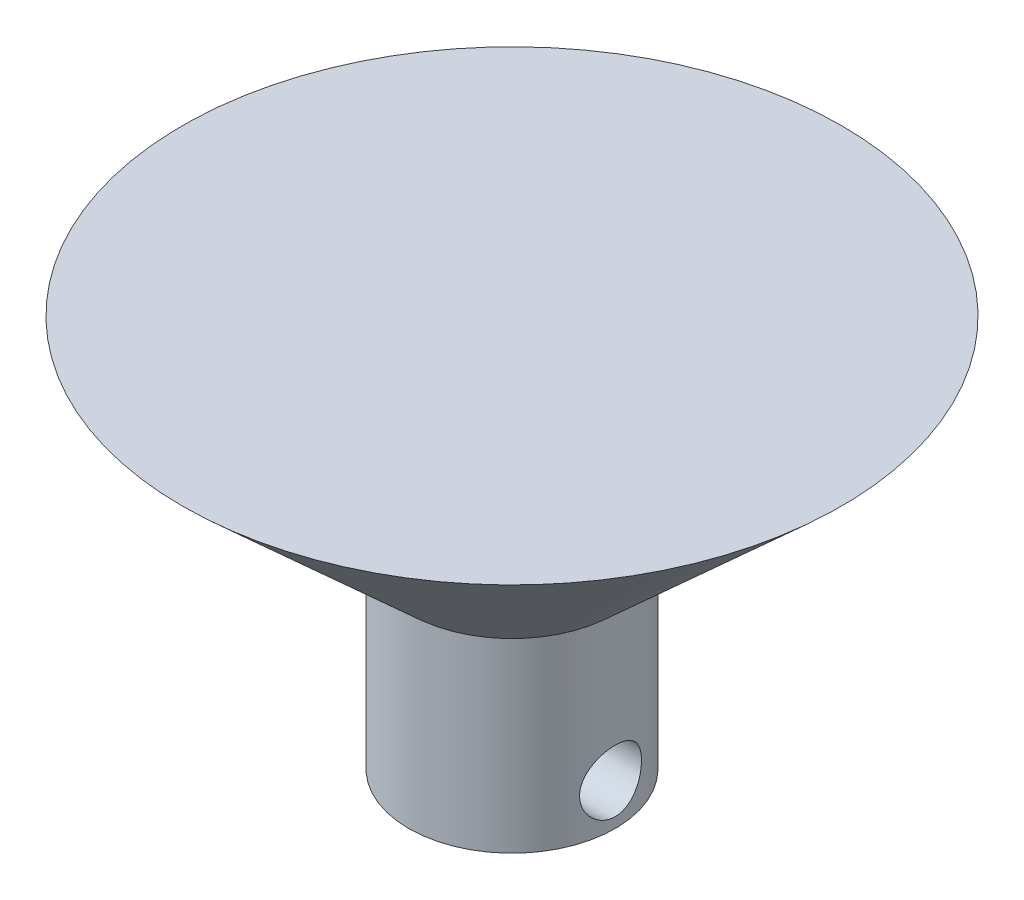
ISO-10303-21;
HEADER;
FILE_DESCRIPTION(('STEP AP214'),'2;1');
FILE_NAME('part.step','',(''),(''),'','','');
FILE_SCHEMA(('AUTOMOTIVE_DESIGN { 1 0 10303 214 1 1 1 1 }'));
ENDSEC;
DATA;
#1=APPLICATION_CONTEXT('core data for automotive mechanical design processes');
#2=APPLICATION_PROTOCOL_DEFINITION('international standard','automotive_design',2000,#1);
#3=PRODUCT_CONTEXT('',#1,'mechanical');
#4=PRODUCT('Part','Part','',(#3));
#5=PRODUCT_RELATED_PRODUCT_CATEGORY('part','',(#4));
#6=PRODUCT_DEFINITION_FORMATION('','',#4);
#7=PRODUCT_DEFINITION_CONTEXT('part definition',#1,'design');
#8=PRODUCT_DEFINITION('design','',#6,#7);
#9=PRODUCT_DEFINITION_SHAPE('','',#8);
#10=(LENGTH_UNIT() NAMED_UNIT(*) SI_UNIT(.MILLI.,.METRE.));
#11=(NAMED_UNIT(*) PLANE_ANGLE_UNIT() SI_UNIT($,.RADIAN.));
#12=(NAMED_UNIT(*) SI_UNIT($,.STERADIAN.) SOLID_ANGLE_UNIT());
#13=UNCERTAINTY_MEASURE_WITH_UNIT(LENGTH_MEASURE(1.E-05),#10,'distance_accuracy_value','');
#14=(GEOMETRIC_REPRESENTATION_CONTEXT(3) GLOBAL_UNCERTAINTY_ASSIGNED_CONTEXT((#13)) GLOBAL_UNIT_ASSIGNED_CONTEXT((#10,
#11,#12)) REPRESENTATION_CONTEXT('',''));
#15=CARTESIAN_POINT('',(0.,0.,0.));
#16=DIRECTION('',(0.,0.,1.));
#17=DIRECTION('',(1.,0.,0.));
#18=AXIS2_PLACEMENT_3D('',#15,#16,#17);
#19=CARTESIAN_POINT('',(0.,9.,0.));
#20=DIRECTION('',(0.,-1.,0.));
#21=DIRECTION('',(0.,0.,-1.));
#22=AXIS2_PLACEMENT_3D('',#19,#20,#21);
#23=CYLINDRICAL_SURFACE('',#22,5.);
#24=CARTESIAN_POINT('',(-5.,0.5,0.));
#25=CARTESIAN_POINT('',(-4.9999992925055,0.500000997484886,-0.0822886127533));
#26=CARTESIAN_POINT('',(-4.99794915693954,0.506793863623966,-0.164587318351529));
#27=CARTESIAN_POINT('',(-4.98997105593691,0.533721354222101,-0.326788125304881));
#28=CARTESIAN_POINT('',(-4.98404193389692,0.553859958023342,-0.40668950441142));
#29=CARTESIAN_POINT('',(-4.96895552501836,0.606746016910264,-0.561732707754527));
#30=CARTESIAN_POINT('',(-4.95980300250425,0.639474869618937,-0.636881364395373));
#31=CARTESIAN_POINT('',(-4.93922109237645,0.716536093055836,-0.780624181053131));
#32=CARTESIAN_POINT('',(-4.92779140192067,0.760870007395417,-0.84921746746967));
#33=CARTESIAN_POINT('',(-4.90350737192774,0.861224007472669,-0.979871797183745));
#34=CARTESIAN_POINT('',(-4.89062383657036,0.917516625885914,-1.04171807124434));
#35=CARTESIAN_POINT('',(-4.86505834210442,1.03960922991018,-1.15524920923324));
#36=CARTESIAN_POINT('',(-4.85237641724501,1.10541081212496,-1.20693236327441));
#37=CARTESIAN_POINT('',(-4.82834113993772,1.24647075303761,-1.29980037723708));
#38=CARTESIAN_POINT('',(-4.81702406663875,1.32190846099074,-1.34072309022213));
#39=CARTESIAN_POINT('',(-4.79743620394031,1.47898925423029,-1.4092139477476));
#40=CARTESIAN_POINT('',(-4.78916468313311,1.56063084392798,-1.43678529919973));
#41=CARTESIAN_POINT('',(-4.77690870838434,1.72539026613046,-1.47701633682652));
#42=CARTESIAN_POINT('',(-4.77281069324533,1.80840274386394,-1.49007196234677));
#43=CARTESIAN_POINT('',(-4.76902789749767,1.97553315621677,-1.50213730614672));
#44=CARTESIAN_POINT('',(-4.76934204760571,2.05965081805909,-1.50115042761078));
#45=CARTESIAN_POINT('',(-4.77424744067778,2.22338390860848,-1.48546977199812));
#46=CARTESIAN_POINT('',(-4.7786838859914,2.30305225036224,-1.47127205262685));
#47=CARTESIAN_POINT('',(-4.79108356228624,2.45881978627346,-1.43037420427056));
#48=CARTESIAN_POINT('',(-4.79904714132351,2.53491862737433,-1.40367284141641));
#49=CARTESIAN_POINT('',(-4.81772733074973,2.68260034966074,-1.33816026653682));
#50=CARTESIAN_POINT('',(-4.82848016115952,2.75410708395526,-1.29918816934642));
#51=CARTESIAN_POINT('',(-4.85150987000065,2.88973202201019,-1.21035222588683));
#52=CARTESIAN_POINT('',(-4.86378711746991,2.95384842941378,-1.16048574002588));
#53=CARTESIAN_POINT('',(-4.88911011297937,3.07568619076202,-1.04881290765546));
#54=CARTESIAN_POINT('',(-4.90216654310498,3.13302866402967,-0.986594907466972));
#55=CARTESIAN_POINT('',(-4.92712244063259,3.23655398406425,-0.853263259313967));
#56=CARTESIAN_POINT('',(-4.9390218351841,3.28273612841443,-0.782149051860888));
#57=CARTESIAN_POINT('',(-4.9604316006947,3.36285992246473,-0.632355038342803));
#58=CARTESIAN_POINT('',(-4.96992543668314,3.39671751624986,-0.55362774974795));
#59=CARTESIAN_POINT('',(-4.98533521832222,3.45059959009963,-0.39124541560352));
#60=CARTESIAN_POINT('',(-4.99125216186999,3.47062792853249,-0.307591751589582));
#61=CARTESIAN_POINT('',(-4.99868364643538,3.49565217789939,-0.140952242668332));
#62=CARTESIAN_POINT('',(-5.0003485041779,3.50116158580161,-0.0580500976011871));
#63=CARTESIAN_POINT('',(-4.9995292324176,3.49843084428792,0.107499605823383));
#64=CARTESIAN_POINT('',(-4.99704565677756,3.49019253034856,0.19014719669078));
#65=CARTESIAN_POINT('',(-4.98830696987163,3.4606153888885,0.350903605309697));
#66=CARTESIAN_POINT('',(-4.98213829799417,3.43957661241913,0.429072772614169));
#67=CARTESIAN_POINT('',(-4.96674347841533,3.3853567672218,0.580754638954522));
#68=CARTESIAN_POINT('',(-4.95751696321085,3.35217423896214,0.654266777025583));
#69=CARTESIAN_POINT('',(-4.93669654351325,3.27374683451887,0.796437189461052));
#70=CARTESIAN_POINT('',(-4.92505280829675,3.22824065905203,0.864943826199669));
#71=CARTESIAN_POINT('',(-4.90073468764318,3.12677524594719,0.993523307980147));
#72=CARTESIAN_POINT('',(-4.8880600443108,3.07081338811233,1.05359403235593));
#73=CARTESIAN_POINT('',(-4.86253171869138,2.94761269163066,1.16585744551027));
#74=CARTESIAN_POINT('',(-4.84968825033268,2.88003812422826,1.21768481231503));
#75=CARTESIAN_POINT('',(-4.82576515238464,2.73687206098647,1.30928995072154));
#76=CARTESIAN_POINT('',(-4.81468547654651,2.66128077544179,1.34906803829472));
#77=CARTESIAN_POINT('',(-4.79567189615055,2.50446750874531,1.41517347127168));
#78=CARTESIAN_POINT('',(-4.78772337843827,2.42327381346341,1.4415634693705));
#79=CARTESIAN_POINT('',(-4.77591594362794,2.25731203106852,1.48021730815114));
#80=CARTESIAN_POINT('',(-4.772055625083,2.17254517921233,1.49248598978779));
#81=CARTESIAN_POINT('',(-4.76899972496087,2.00563848162377,1.50221984485059));
#82=CARTESIAN_POINT('',(-4.76961647442754,1.92353634898242,1.5002805530849));
#83=CARTESIAN_POINT('',(-4.77499401288294,1.7608858966272,1.48307505444813));
#84=CARTESIAN_POINT('',(-4.77975463592551,1.68033751482365,1.46780938124716));
#85=CARTESIAN_POINT('',(-4.79275763670385,1.52405460085715,1.42476888804136));
#86=CARTESIAN_POINT('',(-4.80095604545965,1.44827271263831,1.39715175507068));
#87=CARTESIAN_POINT('',(-4.81990278909136,1.30235756118228,1.33031507121129));
#88=CARTESIAN_POINT('',(-4.83065161194312,1.23222538235924,1.29109329962876));
#89=CARTESIAN_POINT('',(-4.85397676425833,1.09683688347289,1.20048763805072));
#90=CARTESIAN_POINT('',(-4.86660540163798,1.03185123873959,1.14871276092994));
#91=CARTESIAN_POINT('',(-4.89201320450026,0.911297501692137,1.03517434629782));
#92=CARTESIAN_POINT('',(-4.90479240823905,0.855731860532243,0.973408217134502));
#93=CARTESIAN_POINT('',(-4.92950936570649,0.75397658770497,0.839465762183249));
#94=CARTESIAN_POINT('',(-4.94141159765674,0.708108553144511,0.767037885790608));
#95=CARTESIAN_POINT('',(-4.96260680455813,0.629264830095975,0.615141373983529));
#96=CARTESIAN_POINT('',(-4.97190099931067,0.596283111725492,0.535676052998955));
#97=CARTESIAN_POINT('',(-4.98602174969301,0.547104724347251,0.380757712655282));
#98=CARTESIAN_POINT('',(-4.99122027381068,0.529488327116752,0.305786961954234));
#99=CARTESIAN_POINT('',(-4.99820944494492,0.505936474758423,0.15388019523078));
#100=CARTESIAN_POINT('',(-5.0000006615474,0.499999067295181,0.0769445098581397));
#101=CARTESIAN_POINT('',(-5.,0.5,0.));
#102=B_SPLINE_CURVE_WITH_KNOTS('',3,(#24,#25,#26,#27,#28,#29,#30,#31,#32,#33,#34,#35,#36,#37,
#38,#39,#40,#41,#42,#43,#44,#45,#46,#47,#48,#49,#50,#51,#52,#53,#54,#55,#56,#57,#58,#59,#60,#61,
#62,#63,#64,#65,#66,#67,#68,#69,#70,#71,#72,#73,#74,#75,#76,#77,#78,#79,#80,#81,#82,#83,#84,#85,
#86,#87,#88,#89,#90,#91,#92,#93,#94,#95,#96,#97,#98,#99,#100,#101),.UNSPECIFIED.,.T.,.F.,(4,2,2,
2,2,2,2,2,2,2,2,2,2,2,2,2,2,2,2,2,2,2,2,2,2,2,2,2,2,2,2,2,2,2,2,2,2,2,4),(0.,0.246583203612611,
0.493239964846,0.739533676300874,0.985860164412702,1.23855602948191,1.49129437288633,
1.74971481004109,2.00807314543224,2.25919689356599,2.51025978319089,2.75226016697676,
2.99428443658001,3.23962426447119,3.48502360158555,3.74067104048166,3.99633456531071,
4.25371046881688,4.51101453528808,4.75908809438545,5.00712853550327,5.24956746682327,
5.49203554593728,5.74011305702908,5.98825282000191,6.24540400322818,6.5025484425268,
6.75847814951252,7.01432009460283,7.25950155466943,7.504673196616,7.74680040402721,
7.98897397553107,8.23996925679931,8.49102974897502,8.74942996156671,9.00770911595235,
9.23831691930459,9.46888616948874),.UNSPECIFIED.);
#103=CARTESIAN_POINT('',(-5.,0.5,0.));
#104=VERTEX_POINT('',#103);
#105=EDGE_CURVE('E11',#104,#104,#102,.T.);
#106=ORIENTED_EDGE('',*,*,#105,.T.);
#107=EDGE_LOOP('',(#106));
#108=FACE_BOUND('',#107,.T.);
#109=CARTESIAN_POINT('',(4.76969600708473,2.,-1.5));
#110=CARTESIAN_POINT('',(4.7696968572698,1.9178054520576,-1.49999897633764));
#111=CARTESIAN_POINT('',(4.77184390209069,1.83560077585598,-1.49322108167142));
#112=CARTESIAN_POINT('',(4.780165783029,1.67359475040806,-1.46635844446749));
#113=CARTESIAN_POINT('',(4.78634196493468,1.59379421349853,-1.44626925573578));
#114=CARTESIAN_POINT('',(4.80196102485632,1.43896527172827,-1.39352753269955));
#115=CARTESIAN_POINT('',(4.81139846703232,1.36392917036691,-1.36089589394243));
#116=CARTESIAN_POINT('',(4.83246932547567,1.2203780660047,-1.28406421917929));
#117=CARTESIAN_POINT('',(4.84410307041019,1.15186404131556,-1.23986245137053));
#118=CARTESIAN_POINT('',(4.86866862185765,1.02113360942262,-1.13964754141627));
#119=CARTESIAN_POINT('',(4.88162808311636,0.959154102053713,-1.08333207175807));
#120=CARTESIAN_POINT('',(4.90714861936757,0.845362048677491,-0.961136237579599));
#121=CARTESIAN_POINT('',(4.91970964297705,0.793550809550121,-0.895254645461111));
#122=CARTESIAN_POINT('',(4.94333214579389,0.700537300166693,-0.75411143779369));
#123=CARTESIAN_POINT('',(4.95435724342404,0.659576575557191,-0.678684021335815));
#124=CARTESIAN_POINT('',(4.97334435920684,0.591012740957243,-0.521624645369354));
#125=CARTESIAN_POINT('',(4.98130703789495,0.563406750142551,-0.439994028387912));
#126=CARTESIAN_POINT('',(4.99307646003589,0.523119998909491,-0.27532385263083));
#127=CARTESIAN_POINT('',(4.99699557369338,0.510034872347297,-0.192391398953801));
#128=CARTESIAN_POINT('',(5.00063201501348,0.497882675353559,-0.025421823749315));
#129=CARTESIAN_POINT('',(5.00035022521079,0.498812660598037,0.0586150620503682));
#130=CARTESIAN_POINT('',(4.99569603817659,0.514392868543023,0.22257115660016));
#131=CARTESIAN_POINT('',(4.9914542020526,0.528605193809869,0.302536267641341));
#132=CARTESIAN_POINT('',(4.97951522112593,0.56963133599429,0.458889213442527));
#133=CARTESIAN_POINT('',(4.97181785750586,0.596445950942671,0.535276821322846));
#134=CARTESIAN_POINT('',(4.95365220986963,0.662212023418558,0.683347326351281));
#135=CARTESIAN_POINT('',(4.94315269676706,0.701301202807267,0.754965064694478));
#136=CARTESIAN_POINT('',(4.92049640648069,0.790397852428228,0.890764673783156));
#137=CARTESIAN_POINT('',(4.90833923637778,0.840407912963484,0.954944774872131));
#138=CARTESIAN_POINT('',(4.88311550488165,0.952197750751597,1.0766604815298));
#139=CARTESIAN_POINT('',(4.87003195321461,1.01435691902974,1.13384458040111));
#140=CARTESIAN_POINT('',(4.84483979887497,1.14751001789005,1.23707651539824));
#141=CARTESIAN_POINT('',(4.8327312931702,1.21850482538923,1.28312324482853));
#142=CARTESIAN_POINT('',(4.81077903197678,1.36823946924899,1.3631399533545));
#143=CARTESIAN_POINT('',(4.80095810695957,1.44704704586292,1.39698989237679));
#144=CARTESIAN_POINT('',(4.78496392548436,1.60960720844554,1.45083362878413));
#145=CARTESIAN_POINT('',(4.7787894791583,1.69335817153456,1.4708319464056));
#146=CARTESIAN_POINT('',(4.77104849541241,1.86008236073928,1.49574770282165));
#147=CARTESIAN_POINT('',(4.7693187867044,1.94296822389398,1.50119946380212));
#148=CARTESIAN_POINT('',(4.77021192441924,2.10847290000987,1.49835947233062));
#149=CARTESIAN_POINT('',(4.77283416156589,2.19109174873085,1.4900696437133));
#150=CARTESIAN_POINT('',(4.78197558554912,2.35148837797087,1.4604576357419));
#151=CARTESIAN_POINT('',(4.78839176507489,2.42933616426352,1.4394796143128));
#152=CARTESIAN_POINT('',(4.80429141231227,2.58040169081492,1.3854857774794));
#153=CARTESIAN_POINT('',(4.81377535359073,2.65361871414057,1.3524681034276));
#154=CARTESIAN_POINT('',(4.83505835023047,2.79551746407213,1.274318711965));
#155=CARTESIAN_POINT('',(4.84691271069799,2.86402472098579,1.22888564172729));
#156=CARTESIAN_POINT('',(4.87148205646987,2.9926381061808,1.12755301600385));
#157=CARTESIAN_POINT('',(4.88419724730003,3.05274221761279,1.07165095534897));
#158=CARTESIAN_POINT('',(4.90963633548158,3.16518040581474,0.948455132493599));
#159=CARTESIAN_POINT('',(4.92234245063004,3.21713562898698,0.880811065857434));
#160=CARTESIAN_POINT('',(4.94584851748651,3.30896670102775,0.737461784590249));
#161=CARTESIAN_POINT('',(4.95664856384717,3.34884314978146,0.661756970543944));
#162=CARTESIAN_POINT('',(4.97505970474957,3.4150000305683,0.504935504705222));
#163=CARTESIAN_POINT('',(4.98269453424966,3.44138201615898,0.423864622037839));
#164=CARTESIAN_POINT('',(4.99401979596827,3.48006091889042,0.258169966504588));
#165=CARTESIAN_POINT('',(4.9977113567088,3.49236186594842,0.173547217354763));
#166=CARTESIAN_POINT('',(5.00066544081399,3.5022230440545,0.00665215388274265));
#167=CARTESIAN_POINT('',(5.00009305111322,3.50033269540783,-0.0755851790862068));
#168=CARTESIAN_POINT('',(4.99497264465037,3.48317836750088,-0.238519481164404));
#169=CARTESIAN_POINT('',(4.99042485330462,3.46791514651956,-0.319216537346529));
#170=CARTESIAN_POINT('',(4.97791168358327,3.42478833860038,-0.475935813041358));
#171=CARTESIAN_POINT('',(4.96998352900866,3.39706181935099,-0.551998927351392));
#172=CARTESIAN_POINT('',(4.9515294303945,3.32991808549281,-0.698433237752053));
#173=CARTESIAN_POINT('',(4.94100305949946,3.29049894971381,-0.76880349605058));
#174=CARTESIAN_POINT('',(4.91803965828228,3.19962654256996,-0.904301892420563));
#175=CARTESIAN_POINT('',(4.90555226923559,3.14782856999923,-0.969190250076767));
#176=CARTESIAN_POINT('',(4.88023537212334,3.0342896116672,-1.08953757134594));
#177=CARTESIAN_POINT('',(4.86740576641079,2.97254576210185,-1.14499380960194));
#178=CARTESIAN_POINT('',(4.84240680631319,2.83865922168949,-1.24656269394549));
#179=CARTESIAN_POINT('',(4.83026852693485,2.76626144660956,-1.29234759757956));
#180=CARTESIAN_POINT('',(4.80852547508793,2.61444482583898,-1.37104313528776));
#181=CARTESIAN_POINT('',(4.79891948596956,2.53502937639881,-1.40395995557289));
#182=CARTESIAN_POINT('',(4.78427816717594,2.38025956839373,-1.4530194253295));
#183=CARTESIAN_POINT('',(4.7788615484052,2.30539135306901,-1.47058859011232));
#184=CARTESIAN_POINT('',(4.77157042597167,2.15368477750423,-1.49407818835144));
#185=CARTESIAN_POINT('',(4.7696952122143,2.07684681535475,-1.50000095706095));
#186=CARTESIAN_POINT('',(4.76969600708473,2.,-1.5));
#187=B_SPLINE_CURVE_WITH_KNOTS('',3,(#109,#110,#111,#112,#113,#114,#115,#116,#117,#118,#119,
#120,#121,#122,#123,#124,#125,#126,#127,#128,#129,#130,#131,#132,#133,#134,#135,#136,#137,#138,
#139,#140,#141,#142,#143,#144,#145,#146,#147,#148,#149,#150,#151,#152,#153,#154,#155,#156,#157,
#158,#159,#160,#161,#162,#163,#164,#165,#166,#167,#168,#169,#170,#171,#172,#173,#174,#175,#176,
#177,#178,#179,#180,#181,#182,#183,#184,#185,#186),.UNSPECIFIED.,.T.,.F.,(4,2,2,2,2,2,2,2,2,2,2,
2,2,2,2,2,2,2,2,2,2,2,2,2,2,2,2,2,2,2,2,2,2,2,2,2,2,2,4),(0.,0.246300165915542,0.492682641689,
0.738656414466193,0.984667025370101,1.23773150007984,1.49082847871273,1.74915939273645,
2.00743455587877,2.25832140149558,2.5091555410144,2.7520012599088,2.99486235890376,
3.24055209335676,3.4863001659083,3.74152147023278,3.99676812491863,4.25446238246266,
4.51207250628411,4.76008080790309,5.00805439107388,5.24958594938817,5.49115481045787,
5.73920731809388,5.98731925928923,6.24479506100602,6.50225807324202,6.75775391814325,
7.01317662321682,7.2587630391122,7.50433553047755,7.74727096872219,7.99024634491378,
8.24099627054488,8.4918185262989,8.75011639669147,9.00828993963944,9.23861153857447,
9.4688869503356),.UNSPECIFIED.);
#188=CARTESIAN_POINT('',(4.76969600708473,2.,-1.5));
#189=VERTEX_POINT('',#188);
#190=EDGE_CURVE('E41',#189,#189,#187,.T.);
#191=ORIENTED_EDGE('',*,*,#190,.T.);
#192=EDGE_LOOP('',(#191));
#193=FACE_BOUND('',#192,.T.);
#194=CARTESIAN_POINT('',(0.,9.,0.));
#195=DIRECTION('',(0.,1.,0.));
#196=DIRECTION('',(0.,0.,1.));
#197=AXIS2_PLACEMENT_3D('',#194,#195,#196);
#198=CIRCLE('',#197,5.);
#199=CARTESIAN_POINT('',(0.,9.,5.));
#200=VERTEX_POINT('',#199);
#201=EDGE_CURVE('E46',#200,#200,#198,.T.);
#202=ORIENTED_EDGE('',*,*,#201,.F.);
#203=EDGE_LOOP('',(#202));
#204=FACE_BOUND('',#203,.T.);
#205=CARTESIAN_POINT('',(0.,0.,0.));
#206=DIRECTION('',(0.,1.,0.));
#207=DIRECTION('',(0.,0.,1.));
#208=AXIS2_PLACEMENT_3D('',#205,#206,#207);
#209=CIRCLE('',#208,5.);
#210=CARTESIAN_POINT('',(0.,0.,5.));
#211=VERTEX_POINT('',#210);
#212=EDGE_CURVE('E72',#211,#211,#209,.T.);
#213=ORIENTED_EDGE('',*,*,#212,.T.);
#214=EDGE_LOOP('',(#213));
#215=FACE_BOUND('',#214,.T.);
#216=ADVANCED_FACE('F33',(#108,#193,#204,#215),#23,.T.);
#217=CARTESIAN_POINT('',(0.,0.,0.));
#218=DIRECTION('',(0.,1.,0.));
#219=DIRECTION('',(0.,0.,1.));
#220=AXIS2_PLACEMENT_3D('',#217,#218,#219);
#221=PLANE('',#220);
#222=ORIENTED_EDGE('',*,*,#212,.F.);
#223=EDGE_LOOP('',(#222));
#224=FACE_BOUND('',#223,.T.);
#225=ADVANCED_FACE('F59',(#224),#221,.F.);
#226=CARTESIAN_POINT('',(-5.,2.,0.));
#227=DIRECTION('',(1.,0.,0.));
#228=DIRECTION('',(0.,0.,-1.));
#229=AXIS2_PLACEMENT_3D('',#226,#227,#228);
#230=CYLINDRICAL_SURFACE('',#229,1.5);
#231=ORIENTED_EDGE('',*,*,#190,.F.);
#232=EDGE_LOOP('',(#231));
#233=FACE_BOUND('',#232,.T.);
#234=ORIENTED_EDGE('',*,*,#105,.F.);
#235=EDGE_LOOP('',(#234));
#236=FACE_BOUND('',#235,.T.);
#237=ADVANCED_FACE('F54',(#233,#236),#230,.F.);
#238=CARTESIAN_POINT('',(0.,19.,0.));
#239=DIRECTION('',(0.,1.,0.));
#240=DIRECTION('',(0.,0.,1.));
#241=AXIS2_PLACEMENT_3D('',#238,#239,#240);
#242=PLANE('',#241);
#243=CARTESIAN_POINT('',(0.,19.,0.));
#244=DIRECTION('',(0.,1.,0.));
#245=DIRECTION('',(0.,0.,1.));
#246=AXIS2_PLACEMENT_3D('',#243,#244,#245);
#247=CIRCLE('',#246,15.958);
#248=CARTESIAN_POINT('',(0.,19.,15.958));
#249=VERTEX_POINT('',#248);
#250=EDGE_CURVE('E74',#249,#249,#247,.T.);
#251=ORIENTED_EDGE('',*,*,#250,.T.);
#252=EDGE_LOOP('',(#251));
#253=FACE_BOUND('',#252,.T.);
#254=ADVANCED_FACE('F58',(#253),#242,.T.);
#255=CARTESIAN_POINT('',(0.,9.,0.));
#256=DIRECTION('',(0.,1.,0.));
#257=DIRECTION('',(0.,0.,1.));
#258=AXIS2_PLACEMENT_3D('',#255,#256,#257);
#259=CONICAL_SURFACE('',#258,5.,0.831076835273768);
#260=CARTESIAN_POINT('',(0.,19.,15.958));
#261=CARTESIAN_POINT('',(0.,18.8958333333333,15.8438541666667));
#262=CARTESIAN_POINT('',(0.,18.7916666666667,15.7297083333333));
#263=CARTESIAN_POINT('',(0.,18.5833333333333,15.5014166666667));
#264=CARTESIAN_POINT('',(0.,18.4791666666667,15.3872708333333));
#265=CARTESIAN_POINT('',(0.,18.2708333333333,15.1589791666667));
#266=CARTESIAN_POINT('',(0.,18.1666666666667,15.0448333333333));
#267=CARTESIAN_POINT('',(0.,17.9583333333333,14.8165416666667));
#268=CARTESIAN_POINT('',(0.,17.8541666666667,14.7023958333333));
#269=CARTESIAN_POINT('',(0.,17.6458333333333,14.4741041666667));
#270=CARTESIAN_POINT('',(0.,17.5416666666667,14.3599583333333));
#271=CARTESIAN_POINT('',(0.,17.3333333333333,14.1316666666667));
#272=CARTESIAN_POINT('',(0.,17.2291666666667,14.0175208333333));
#273=CARTESIAN_POINT('',(0.,17.0208333333333,13.7892291666667));
#274=CARTESIAN_POINT('',(0.,16.9166666666667,13.6750833333333));
#275=CARTESIAN_POINT('',(0.,16.7083333333333,13.4467916666667));
#276=CARTESIAN_POINT('',(0.,16.6041666666667,13.3326458333333));
#277=CARTESIAN_POINT('',(0.,16.3958333333333,13.1043541666667));
#278=CARTESIAN_POINT('',(0.,16.2916666666667,12.9902083333333));
#279=CARTESIAN_POINT('',(0.,16.0833333333333,12.7619166666667));
#280=CARTESIAN_POINT('',(0.,15.9791666666667,12.6477708333333));
#281=CARTESIAN_POINT('',(0.,15.7708333333333,12.4194791666667));
#282=CARTESIAN_POINT('',(0.,15.6666666666667,12.3053333333333));
#283=CARTESIAN_POINT('',(0.,15.4583333333333,12.0770416666667));
#284=CARTESIAN_POINT('',(0.,15.3541666666667,11.9628958333333));
#285=CARTESIAN_POINT('',(0.,15.1458333333333,11.7346041666667));
#286=CARTESIAN_POINT('',(0.,15.0416666666667,11.6204583333333));
#287=CARTESIAN_POINT('',(0.,14.8333333333333,11.3921666666667));
#288=CARTESIAN_POINT('',(0.,14.7291666666667,11.2780208333333));
#289=CARTESIAN_POINT('',(0.,14.5208333333333,11.0497291666667));
#290=CARTESIAN_POINT('',(0.,14.4166666666667,10.9355833333333));
#291=CARTESIAN_POINT('',(0.,14.2083333333333,10.7072916666667));
#292=CARTESIAN_POINT('',(0.,14.1041666666667,10.5931458333333));
#293=CARTESIAN_POINT('',(0.,13.8958333333333,10.3648541666667));
#294=CARTESIAN_POINT('',(0.,13.7916666666667,10.2507083333333));
#295=CARTESIAN_POINT('',(0.,13.5833333333333,10.0224166666667));
#296=CARTESIAN_POINT('',(0.,13.4791666666667,9.90827083333333));
#297=CARTESIAN_POINT('',(0.,13.2708333333333,9.67997916666667));
#298=CARTESIAN_POINT('',(0.,13.1666666666667,9.56583333333333));
#299=CARTESIAN_POINT('',(0.,12.9583333333333,9.33754166666667));
#300=CARTESIAN_POINT('',(0.,12.8541666666667,9.22339583333333));
#301=CARTESIAN_POINT('',(0.,12.6458333333333,8.99510416666667));
#302=CARTESIAN_POINT('',(0.,12.5416666666667,8.88095833333333));
#303=CARTESIAN_POINT('',(0.,12.3333333333333,8.65266666666667));
#304=CARTESIAN_POINT('',(0.,12.2291666666667,8.53852083333333));
#305=CARTESIAN_POINT('',(0.,12.0208333333333,8.31022916666667));
#306=CARTESIAN_POINT('',(0.,11.9166666666667,8.19608333333333));
#307=CARTESIAN_POINT('',(0.,11.7083333333333,7.96779166666667));
#308=CARTESIAN_POINT('',(0.,11.6041666666667,7.85364583333333));
#309=CARTESIAN_POINT('',(0.,11.3958333333333,7.62535416666667));
#310=CARTESIAN_POINT('',(0.,11.2916666666667,7.51120833333333));
#311=CARTESIAN_POINT('',(0.,11.0833333333333,7.28291666666667));
#312=CARTESIAN_POINT('',(0.,10.9791666666667,7.16877083333333));
#313=CARTESIAN_POINT('',(0.,10.7708333333333,6.94047916666667));
#314=CARTESIAN_POINT('',(0.,10.6666666666667,6.82633333333333));
#315=CARTESIAN_POINT('',(0.,10.4583333333333,6.59804166666667));
#316=CARTESIAN_POINT('',(0.,10.3541666666667,6.48389583333333));
#317=CARTESIAN_POINT('',(0.,10.1458333333333,6.25560416666667));
#318=CARTESIAN_POINT('',(0.,10.0416666666667,6.14145833333333));
#319=CARTESIAN_POINT('',(0.,9.83333333333333,5.91316666666667));
#320=CARTESIAN_POINT('',(0.,9.72916666666667,5.79902083333333));
#321=CARTESIAN_POINT('',(0.,9.52083333333333,5.57072916666667));
#322=CARTESIAN_POINT('',(0.,9.41666666666667,5.45658333333333));
#323=CARTESIAN_POINT('',(0.,9.20833333333333,5.22829166666667));
#324=CARTESIAN_POINT('',(0.,9.10416666666667,5.11414583333333));
#325=CARTESIAN_POINT('',(0.,9.,5.));
#326=B_SPLINE_CURVE_WITH_KNOTS('',3,(#260,#261,#262,#263,#264,#265,#266,#267,#268,#269,#270,
#271,#272,#273,#274,#275,#276,#277,#278,#279,#280,#281,#282,#283,#284,#285,#286,#287,#288,#289,
#290,#291,#292,#293,#294,#295,#296,#297,#298,#299,#300,#301,#302,#303,#304,#305,#306,#307,#308,
#309,#310,#311,#312,#313,#314,#315,#316,#317,#318,#319,#320,#321,#322,#323,#324,#325),
.UNSPECIFIED.,.F.,.F.,(4,2,2,2,2,2,2,2,2,2,2,2,2,2,2,2,2,2,2,2,2,2,2,2,2,2,2,2,2,2,2,2,4),(0.,
0.46359431770272,0.92718863540544,1.39078295310816,1.85437727081088,2.3179715885136,
2.78156590621631,3.24516022391903,3.70875454162175,4.17234885932447,4.63594317702719,
5.09953749472991,5.56313181243263,6.02672613013535,6.49032044783807,6.95391476554079,
7.41750908324351,7.88110340094623,8.34469771864895,8.80829203635167,9.27188635405439,
9.73548067175711,10.1990749894598,10.6626693071625,11.1262636248653,11.589857942568,
12.0534522602707,12.5170465779734,12.9806408956761,13.4442352133789,13.9078295310816,
14.3714238487843,14.835018166487),.UNSPECIFIED.);
#327=EDGE_CURVE('BSEAM61',#249,#200,#326,.T.);
#328=ORIENTED_EDGE('',*,*,#250,.F.);
#329=ORIENTED_EDGE('',*,*,#201,.T.);
#330=ORIENTED_EDGE('',*,*,#327,.T.);
#331=ORIENTED_EDGE('',*,*,#327,.F.);
#332=EDGE_LOOP('',(#328,#330,#329,#331));
#333=FACE_BOUND('',#332,.T.);
#334=ADVANCED_FACE('F61',(#333),#259,.T.);
#335=CLOSED_SHELL('',(#216,#225,#237,#254,#334));
#336=MANIFOLD_SOLID_BREP('B2',#335);
#337=ADVANCED_BREP_SHAPE_REPRESENTATION('',(#18,#336),#14);
#338=SHAPE_DEFINITION_REPRESENTATION(#9,#337);
ENDSEC;
END-ISO-10303-21;
